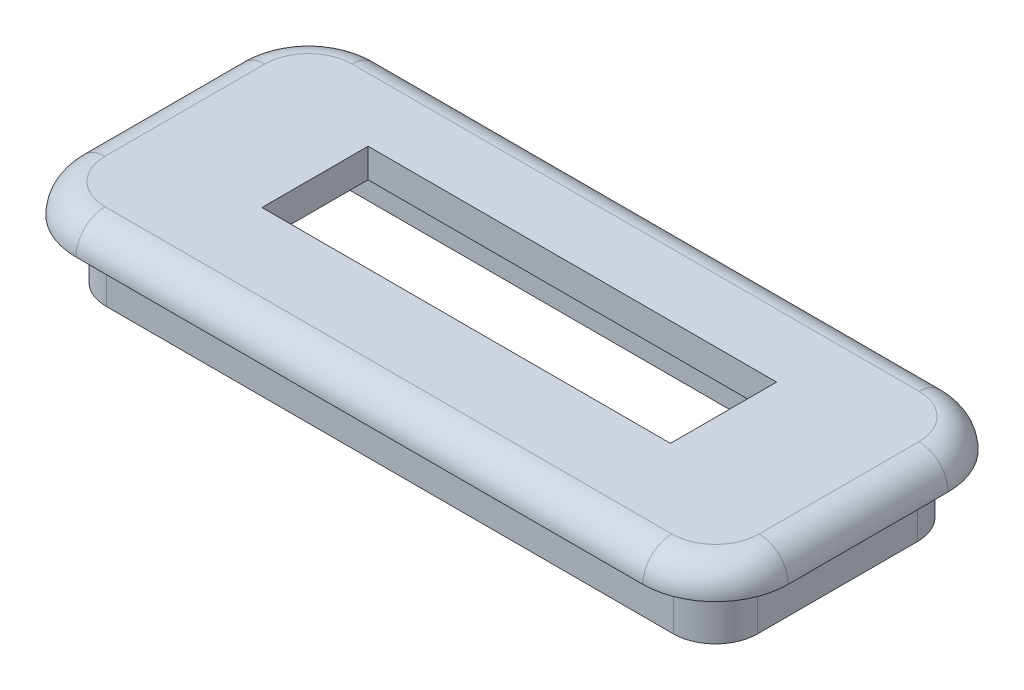
ISO-10303-21;
HEADER;
FILE_DESCRIPTION(('STEP AP214'),'2;1');
FILE_NAME('part.step','',(''),(''),'','','');
FILE_SCHEMA(('AUTOMOTIVE_DESIGN { 1 0 10303 214 1 1 1 1 }'));
ENDSEC;
DATA;
#1=APPLICATION_CONTEXT('core data for automotive mechanical design processes');
#2=APPLICATION_PROTOCOL_DEFINITION('international standard','automotive_design',2000,#1);
#3=PRODUCT_CONTEXT('',#1,'mechanical');
#4=PRODUCT('Part','Part','',(#3));
#5=PRODUCT_RELATED_PRODUCT_CATEGORY('part','',(#4));
#6=PRODUCT_DEFINITION_FORMATION('','',#4);
#7=PRODUCT_DEFINITION_CONTEXT('part definition',#1,'design');
#8=PRODUCT_DEFINITION('design','',#6,#7);
#9=PRODUCT_DEFINITION_SHAPE('','',#8);
#10=(LENGTH_UNIT() NAMED_UNIT(*) SI_UNIT(.MILLI.,.METRE.));
#11=(NAMED_UNIT(*) PLANE_ANGLE_UNIT() SI_UNIT($,.RADIAN.));
#12=(NAMED_UNIT(*) SI_UNIT($,.STERADIAN.) SOLID_ANGLE_UNIT());
#13=UNCERTAINTY_MEASURE_WITH_UNIT(LENGTH_MEASURE(1.E-05),#10,'distance_accuracy_value','');
#14=(GEOMETRIC_REPRESENTATION_CONTEXT(3) GLOBAL_UNCERTAINTY_ASSIGNED_CONTEXT((#13)) GLOBAL_UNIT_ASSIGNED_CONTEXT((#10,
#11,#12)) REPRESENTATION_CONTEXT('',''));
#15=CARTESIAN_POINT('',(0.,0.,0.));
#16=DIRECTION('',(0.,0.,1.));
#17=DIRECTION('',(1.,0.,0.));
#18=AXIS2_PLACEMENT_3D('',#15,#16,#17);
#19=CARTESIAN_POINT('',(-19.5,0.,5.5));
#20=DIRECTION('',(0.,1.,0.));
#21=DIRECTION('',(0.,0.,1.));
#22=AXIS2_PLACEMENT_3D('',#19,#20,#21);
#23=PLANE('',#22);
#24=CARTESIAN_POINT('',(-19.5,0.,5.5));
#25=DIRECTION('',(0.,1.,0.));
#26=DIRECTION('',(0.,0.,1.));
#27=AXIS2_PLACEMENT_3D('',#24,#25,#26);
#28=CIRCLE('',#27,5.);
#29=CARTESIAN_POINT('',(-24.5,0.,5.49999999999996));
#30=VERTEX_POINT('',#29);
#31=CARTESIAN_POINT('',(-19.5,0.,10.5));
#32=VERTEX_POINT('',#31);
#33=EDGE_CURVE('E381',#30,#32,#28,.T.);
#34=ORIENTED_EDGE('',*,*,#33,.F.);
#35=DIRECTION('',(0.,0.,1.));
#36=VECTOR('',#35,1.);
#37=CARTESIAN_POINT('',(-24.5,0.,-5.49999999999997));
#38=LINE('',#37,#36);
#39=CARTESIAN_POINT('',(-24.5,0.,-5.49999999999997));
#40=VERTEX_POINT('',#39);
#41=EDGE_CURVE('E402',#40,#30,#38,.T.);
#42=ORIENTED_EDGE('',*,*,#41,.F.);
#43=CARTESIAN_POINT('',(-19.5,0.,-5.5));
#44=DIRECTION('',(0.,1.,0.));
#45=DIRECTION('',(0.,0.,1.));
#46=AXIS2_PLACEMENT_3D('',#43,#44,#45);
#47=CIRCLE('',#46,5.);
#48=CARTESIAN_POINT('',(-19.5,0.,-10.5));
#49=VERTEX_POINT('',#48);
#50=EDGE_CURVE('E399',#49,#40,#47,.T.);
#51=ORIENTED_EDGE('',*,*,#50,.F.);
#52=DIRECTION('',(-1.,0.,0.));
#53=VECTOR('',#52,1.);
#54=CARTESIAN_POINT('',(-19.5,0.,-10.5));
#55=LINE('',#54,#53);
#56=CARTESIAN_POINT('',(19.5,0.,-10.5));
#57=VERTEX_POINT('',#56);
#58=EDGE_CURVE('E396',#57,#49,#55,.T.);
#59=ORIENTED_EDGE('',*,*,#58,.F.);
#60=CARTESIAN_POINT('',(19.5,0.,-5.5));
#61=DIRECTION('',(0.,1.,0.));
#62=DIRECTION('',(0.,0.,-1.));
#63=AXIS2_PLACEMENT_3D('',#60,#61,#62);
#64=CIRCLE('',#63,5.);
#65=CARTESIAN_POINT('',(24.5,0.,-5.49999999999997));
#66=VERTEX_POINT('',#65);
#67=EDGE_CURVE('E393',#66,#57,#64,.T.);
#68=ORIENTED_EDGE('',*,*,#67,.F.);
#69=DIRECTION('',(0.,0.,-1.));
#70=VECTOR('',#69,1.);
#71=CARTESIAN_POINT('',(24.5,0.,-5.49999999999997));
#72=LINE('',#71,#70);
#73=CARTESIAN_POINT('',(24.5,0.,5.49999999999996));
#74=VERTEX_POINT('',#73);
#75=EDGE_CURVE('E390',#74,#66,#72,.T.);
#76=ORIENTED_EDGE('',*,*,#75,.F.);
#77=CARTESIAN_POINT('',(19.5,0.,5.5));
#78=DIRECTION('',(0.,1.,0.));
#79=DIRECTION('',(0.,0.,1.));
#80=AXIS2_PLACEMENT_3D('',#77,#78,#79);
#81=CIRCLE('',#80,5.);
#82=CARTESIAN_POINT('',(19.5,0.,10.5));
#83=VERTEX_POINT('',#82);
#84=EDGE_CURVE('E387',#83,#74,#81,.T.);
#85=ORIENTED_EDGE('',*,*,#84,.F.);
#86=DIRECTION('',(1.,0.,0.));
#87=VECTOR('',#86,1.);
#88=CARTESIAN_POINT('',(-19.5,0.,10.5));
#89=LINE('',#88,#87);
#90=EDGE_CURVE('E384',#32,#83,#89,.T.);
#91=ORIENTED_EDGE('',*,*,#90,.F.);
#92=EDGE_LOOP('',(#34,#42,#51,#59,#68,#76,#85,#91));
#93=FACE_BOUND('',#92,.T.);
#94=CARTESIAN_POINT('',(-19.5,0.,5.5));
#95=DIRECTION('',(0.,-1.,0.));
#96=DIRECTION('',(0.,0.,-1.));
#97=AXIS2_PLACEMENT_3D('',#94,#95,#96);
#98=CIRCLE('',#97,2.9);
#99=CARTESIAN_POINT('',(-19.5,0.,8.4));
#100=VERTEX_POINT('',#99);
#101=CARTESIAN_POINT('',(-22.4,0.,5.49999999999998));
#102=VERTEX_POINT('',#101);
#103=EDGE_CURVE('E316',#100,#102,#98,.T.);
#104=ORIENTED_EDGE('',*,*,#103,.F.);
#105=DIRECTION('',(-1.,0.,0.));
#106=VECTOR('',#105,1.);
#107=CARTESIAN_POINT('',(19.5,0.,8.4));
#108=LINE('',#107,#106);
#109=CARTESIAN_POINT('',(19.5,0.,8.4));
#110=VERTEX_POINT('',#109);
#111=EDGE_CURVE('E321',#110,#100,#108,.T.);
#112=ORIENTED_EDGE('',*,*,#111,.F.);
#113=CARTESIAN_POINT('',(19.5,0.,5.5));
#114=DIRECTION('',(0.,-1.,0.));
#115=DIRECTION('',(0.,0.,-1.));
#116=AXIS2_PLACEMENT_3D('',#113,#114,#115);
#117=CIRCLE('',#116,2.9);
#118=CARTESIAN_POINT('',(22.4,0.,5.49999999999996));
#119=VERTEX_POINT('',#118);
#120=EDGE_CURVE('E353',#119,#110,#117,.T.);
#121=ORIENTED_EDGE('',*,*,#120,.F.);
#122=DIRECTION('',(0.,0.,1.));
#123=VECTOR('',#122,1.);
#124=CARTESIAN_POINT('',(22.4,0.,-5.5));
#125=LINE('',#124,#123);
#126=CARTESIAN_POINT('',(22.4,0.,-5.5));
#127=VERTEX_POINT('',#126);
#128=EDGE_CURVE('E350',#127,#119,#125,.T.);
#129=ORIENTED_EDGE('',*,*,#128,.F.);
#130=CARTESIAN_POINT('',(19.5,0.,-5.5));
#131=DIRECTION('',(0.,-1.,0.));
#132=DIRECTION('',(0.,0.,-1.));
#133=AXIS2_PLACEMENT_3D('',#130,#131,#132);
#134=CIRCLE('',#133,2.9);
#135=CARTESIAN_POINT('',(19.5,0.,-8.4));
#136=VERTEX_POINT('',#135);
#137=EDGE_CURVE('E347',#136,#127,#134,.T.);
#138=ORIENTED_EDGE('',*,*,#137,.F.);
#139=DIRECTION('',(1.,0.,0.));
#140=VECTOR('',#139,1.);
#141=CARTESIAN_POINT('',(-19.5,0.,-8.4));
#142=LINE('',#141,#140);
#143=CARTESIAN_POINT('',(-19.5,0.,-8.4));
#144=VERTEX_POINT('',#143);
#145=EDGE_CURVE('E344',#144,#136,#142,.T.);
#146=ORIENTED_EDGE('',*,*,#145,.F.);
#147=CARTESIAN_POINT('',(-19.5,0.,-5.5));
#148=DIRECTION('',(0.,-1.,0.));
#149=DIRECTION('',(0.,0.,-1.));
#150=AXIS2_PLACEMENT_3D('',#147,#148,#149);
#151=CIRCLE('',#150,2.9);
#152=CARTESIAN_POINT('',(-22.4,0.,-5.49999999999997));
#153=VERTEX_POINT('',#152);
#154=EDGE_CURVE('E341',#153,#144,#151,.T.);
#155=ORIENTED_EDGE('',*,*,#154,.F.);
#156=DIRECTION('',(0.,0.,-1.));
#157=VECTOR('',#156,1.);
#158=CARTESIAN_POINT('',(-22.4,0.,5.49999999999998));
#159=LINE('',#158,#157);
#160=EDGE_CURVE('E338',#102,#153,#159,.T.);
#161=ORIENTED_EDGE('',*,*,#160,.F.);
#162=EDGE_LOOP('',(#104,#112,#121,#129,#138,#146,#155,#161));
#163=FACE_BOUND('',#162,.T.);
#164=ADVANCED_FACE('F39',(#93,#163),#23,.F.);
#165=CARTESIAN_POINT('',(-19.5,2.,5.5));
#166=DIRECTION('',(0.,1.,0.));
#167=DIRECTION('',(0.,0.,1.));
#168=AXIS2_PLACEMENT_3D('',#165,#166,#167);
#169=PLANE('',#168);
#170=DIRECTION('',(-1.,0.,0.));
#171=VECTOR('',#170,1.);
#172=CARTESIAN_POINT('',(-19.5,2.,-8.5));
#173=LINE('',#172,#171);
#174=CARTESIAN_POINT('',(19.5,2.,-8.5));
#175=VERTEX_POINT('',#174);
#176=CARTESIAN_POINT('',(-19.5,2.,-8.5));
#177=VERTEX_POINT('',#176);
#178=EDGE_CURVE('E48',#175,#177,#173,.T.);
#179=ORIENTED_EDGE('',*,*,#178,.T.);
#180=CARTESIAN_POINT('',(-19.5,2.,-5.5));
#181=DIRECTION('',(0.,1.,0.));
#182=DIRECTION('',(0.,0.,1.));
#183=AXIS2_PLACEMENT_3D('',#180,#181,#182);
#184=CIRCLE('',#183,3.);
#185=CARTESIAN_POINT('',(-22.5,2.,-5.49999999999998));
#186=VERTEX_POINT('',#185);
#187=EDGE_CURVE('E11',#177,#186,#184,.T.);
#188=ORIENTED_EDGE('',*,*,#187,.T.);
#189=DIRECTION('',(0.,0.,1.));
#190=VECTOR('',#189,1.);
#191=CARTESIAN_POINT('',(-22.5,2.,5.49999999999996));
#192=LINE('',#191,#190);
#193=CARTESIAN_POINT('',(-22.5,2.,5.49999999999998));
#194=VERTEX_POINT('',#193);
#195=EDGE_CURVE('E414',#186,#194,#192,.T.);
#196=ORIENTED_EDGE('',*,*,#195,.T.);
#197=CARTESIAN_POINT('',(-19.5,2.,5.5));
#198=DIRECTION('',(0.,1.,0.));
#199=DIRECTION('',(0.,0.,1.));
#200=AXIS2_PLACEMENT_3D('',#197,#198,#199);
#201=CIRCLE('',#200,3.);
#202=CARTESIAN_POINT('',(-19.5,2.,8.5));
#203=VERTEX_POINT('',#202);
#204=EDGE_CURVE('E416',#194,#203,#201,.T.);
#205=ORIENTED_EDGE('',*,*,#204,.T.);
#206=DIRECTION('',(1.,0.,0.));
#207=VECTOR('',#206,1.);
#208=CARTESIAN_POINT('',(19.5,2.,8.5));
#209=LINE('',#208,#207);
#210=CARTESIAN_POINT('',(19.5,2.,8.5));
#211=VERTEX_POINT('',#210);
#212=EDGE_CURVE('E418',#203,#211,#209,.T.);
#213=ORIENTED_EDGE('',*,*,#212,.T.);
#214=CARTESIAN_POINT('',(19.5,2.,5.5));
#215=DIRECTION('',(0.,1.,0.));
#216=DIRECTION('',(0.,0.,1.));
#217=AXIS2_PLACEMENT_3D('',#214,#215,#216);
#218=CIRCLE('',#217,3.);
#219=CARTESIAN_POINT('',(22.5,2.,5.49999999999997));
#220=VERTEX_POINT('',#219);
#221=EDGE_CURVE('E420',#211,#220,#218,.T.);
#222=ORIENTED_EDGE('',*,*,#221,.T.);
#223=DIRECTION('',(0.,0.,-1.));
#224=VECTOR('',#223,1.);
#225=CARTESIAN_POINT('',(22.5,2.,-5.49999999999997));
#226=LINE('',#225,#224);
#227=CARTESIAN_POINT('',(22.5,2.,-5.49999999999998));
#228=VERTEX_POINT('',#227);
#229=EDGE_CURVE('E422',#220,#228,#226,.T.);
#230=ORIENTED_EDGE('',*,*,#229,.T.);
#231=CARTESIAN_POINT('',(19.5,2.,-5.5));
#232=DIRECTION('',(0.,1.,0.));
#233=DIRECTION('',(0.,0.,1.));
#234=AXIS2_PLACEMENT_3D('',#231,#232,#233);
#235=CIRCLE('',#234,3.);
#236=EDGE_CURVE('E59',#228,#175,#235,.T.);
#237=ORIENTED_EDGE('',*,*,#236,.T.);
#238=EDGE_LOOP('',(#179,#188,#196,#205,#213,#222,#230,#237));
#239=FACE_BOUND('',#238,.T.);
#240=DIRECTION('',(0.,0.,-1.));
#241=VECTOR('',#240,1.);
#242=CARTESIAN_POINT('',(14.05,2.,-4.15));
#243=LINE('',#242,#241);
#244=CARTESIAN_POINT('',(14.05,2.,3.15));
#245=VERTEX_POINT('',#244);
#246=CARTESIAN_POINT('',(14.05,2.,-4.15));
#247=VERTEX_POINT('',#246);
#248=EDGE_CURVE('E245',#245,#247,#243,.T.);
#249=ORIENTED_EDGE('',*,*,#248,.F.);
#250=DIRECTION('',(1.,0.,0.));
#251=VECTOR('',#250,1.);
#252=CARTESIAN_POINT('',(-14.05,2.,3.15));
#253=LINE('',#252,#251);
#254=CARTESIAN_POINT('',(-14.05,2.,3.15));
#255=VERTEX_POINT('',#254);
#256=EDGE_CURVE('E249',#255,#245,#253,.T.);
#257=ORIENTED_EDGE('',*,*,#256,.F.);
#258=DIRECTION('',(0.,0.,1.));
#259=VECTOR('',#258,1.);
#260=CARTESIAN_POINT('',(-14.05,2.,-4.15));
#261=LINE('',#260,#259);
#262=CARTESIAN_POINT('',(-14.05,2.,-4.15));
#263=VERTEX_POINT('',#262);
#264=EDGE_CURVE('E229',#263,#255,#261,.T.);
#265=ORIENTED_EDGE('',*,*,#264,.F.);
#266=DIRECTION('',(-1.,0.,0.));
#267=VECTOR('',#266,1.);
#268=CARTESIAN_POINT('',(-14.05,2.,-4.15));
#269=LINE('',#268,#267);
#270=EDGE_CURVE('E240',#247,#263,#269,.T.);
#271=ORIENTED_EDGE('',*,*,#270,.F.);
#272=EDGE_LOOP('',(#249,#257,#265,#271));
#273=FACE_BOUND('',#272,.T.);
#274=ADVANCED_FACE('F247',(#239,#273),#169,.T.);
#275=CARTESIAN_POINT('',(-19.5,-4.,5.5));
#276=DIRECTION('',(0.,-1.,0.));
#277=DIRECTION('',(0.,0.,-1.));
#278=AXIS2_PLACEMENT_3D('',#275,#276,#277);
#279=PLANE('',#278);
#280=CARTESIAN_POINT('',(-19.5,-4.,5.5));
#281=DIRECTION('',(0.,-1.,0.));
#282=DIRECTION('',(0.,0.,-1.));
#283=AXIS2_PLACEMENT_3D('',#280,#281,#282);
#284=CIRCLE('',#283,2.9);
#285=CARTESIAN_POINT('',(-19.5,-4.,8.4));
#286=VERTEX_POINT('',#285);
#287=CARTESIAN_POINT('',(-22.4,-4.,5.49999999999998));
#288=VERTEX_POINT('',#287);
#289=EDGE_CURVE('E317',#286,#288,#284,.T.);
#290=ORIENTED_EDGE('',*,*,#289,.T.);
#291=DIRECTION('',(0.,0.,-1.));
#292=VECTOR('',#291,1.);
#293=CARTESIAN_POINT('',(-22.4,-4.,5.49999999999998));
#294=LINE('',#293,#292);
#295=CARTESIAN_POINT('',(-22.4,-4.,-5.49999999999997));
#296=VERTEX_POINT('',#295);
#297=EDGE_CURVE('E320',#288,#296,#294,.T.);
#298=ORIENTED_EDGE('',*,*,#297,.T.);
#299=CARTESIAN_POINT('',(-19.5,-4.,-5.5));
#300=DIRECTION('',(0.,-1.,0.));
#301=DIRECTION('',(0.,0.,-1.));
#302=AXIS2_PLACEMENT_3D('',#299,#300,#301);
#303=CIRCLE('',#302,2.9);
#304=CARTESIAN_POINT('',(-19.5,-4.,-8.4));
#305=VERTEX_POINT('',#304);
#306=EDGE_CURVE('E323',#296,#305,#303,.T.);
#307=ORIENTED_EDGE('',*,*,#306,.T.);
#308=DIRECTION('',(1.,0.,0.));
#309=VECTOR('',#308,1.);
#310=CARTESIAN_POINT('',(-19.5,-4.,-8.4));
#311=LINE('',#310,#309);
#312=CARTESIAN_POINT('',(19.5,-4.,-8.4));
#313=VERTEX_POINT('',#312);
#314=EDGE_CURVE('E325',#305,#313,#311,.T.);
#315=ORIENTED_EDGE('',*,*,#314,.T.);
#316=CARTESIAN_POINT('',(19.5,-4.,-5.5));
#317=DIRECTION('',(0.,-1.,0.));
#318=DIRECTION('',(0.,0.,-1.));
#319=AXIS2_PLACEMENT_3D('',#316,#317,#318);
#320=CIRCLE('',#319,2.9);
#321=CARTESIAN_POINT('',(22.4,-4.,-5.5));
#322=VERTEX_POINT('',#321);
#323=EDGE_CURVE('E327',#313,#322,#320,.T.);
#324=ORIENTED_EDGE('',*,*,#323,.T.);
#325=DIRECTION('',(0.,0.,1.));
#326=VECTOR('',#325,1.);
#327=CARTESIAN_POINT('',(22.4,-4.,-5.5));
#328=LINE('',#327,#326);
#329=CARTESIAN_POINT('',(22.4,-4.,5.49999999999996));
#330=VERTEX_POINT('',#329);
#331=EDGE_CURVE('E329',#322,#330,#328,.T.);
#332=ORIENTED_EDGE('',*,*,#331,.T.);
#333=CARTESIAN_POINT('',(19.5,-4.,5.5));
#334=DIRECTION('',(0.,-1.,0.));
#335=DIRECTION('',(0.,0.,-1.));
#336=AXIS2_PLACEMENT_3D('',#333,#334,#335);
#337=CIRCLE('',#336,2.9);
#338=CARTESIAN_POINT('',(19.5,-4.,8.4));
#339=VERTEX_POINT('',#338);
#340=EDGE_CURVE('E331',#330,#339,#337,.T.);
#341=ORIENTED_EDGE('',*,*,#340,.T.);
#342=DIRECTION('',(-1.,0.,0.));
#343=VECTOR('',#342,1.);
#344=CARTESIAN_POINT('',(19.5,-4.,8.4));
#345=LINE('',#344,#343);
#346=EDGE_CURVE('E333',#339,#286,#345,.T.);
#347=ORIENTED_EDGE('',*,*,#346,.T.);
#348=EDGE_LOOP('',(#290,#298,#307,#315,#324,#332,#341,#347));
#349=FACE_BOUND('',#348,.T.);
#350=DIRECTION('',(0.,0.,-1.));
#351=VECTOR('',#350,1.);
#352=CARTESIAN_POINT('',(-20.9,-4.,5.49999999999999));
#353=LINE('',#352,#351);
#354=CARTESIAN_POINT('',(-20.9,-4.,5.49999999999999));
#355=VERTEX_POINT('',#354);
#356=CARTESIAN_POINT('',(-20.9,-4.,-5.49999999999997));
#357=VERTEX_POINT('',#356);
#358=EDGE_CURVE('E261',#355,#357,#353,.T.);
#359=ORIENTED_EDGE('',*,*,#358,.F.);
#360=CARTESIAN_POINT('',(-19.5,-4.,5.5));
#361=DIRECTION('',(0.,-1.,0.));
#362=DIRECTION('',(0.,0.,-1.));
#363=AXIS2_PLACEMENT_3D('',#360,#361,#362);
#364=CIRCLE('',#363,1.4);
#365=CARTESIAN_POINT('',(-19.5,-4.,6.9));
#366=VERTEX_POINT('',#365);
#367=EDGE_CURVE('E259',#366,#355,#364,.T.);
#368=ORIENTED_EDGE('',*,*,#367,.F.);
#369=DIRECTION('',(-1.,0.,0.));
#370=VECTOR('',#369,1.);
#371=CARTESIAN_POINT('',(19.5,-4.,6.9));
#372=LINE('',#371,#370);
#373=CARTESIAN_POINT('',(19.5,-4.,6.9));
#374=VERTEX_POINT('',#373);
#375=EDGE_CURVE('E275',#374,#366,#372,.T.);
#376=ORIENTED_EDGE('',*,*,#375,.F.);
#377=CARTESIAN_POINT('',(19.5,-4.,5.5));
#378=DIRECTION('',(0.,-1.,0.));
#379=DIRECTION('',(0.,0.,-1.));
#380=AXIS2_PLACEMENT_3D('',#377,#378,#379);
#381=CIRCLE('',#380,1.4);
#382=CARTESIAN_POINT('',(20.9,-4.,5.49999999999996));
#383=VERTEX_POINT('',#382);
#384=EDGE_CURVE('E272',#383,#374,#381,.T.);
#385=ORIENTED_EDGE('',*,*,#384,.F.);
#386=DIRECTION('',(0.,0.,1.));
#387=VECTOR('',#386,1.);
#388=CARTESIAN_POINT('',(20.9,-4.,-5.5));
#389=LINE('',#388,#387);
#390=CARTESIAN_POINT('',(20.9,-4.,-5.5));
#391=VERTEX_POINT('',#390);
#392=EDGE_CURVE('E270',#391,#383,#389,.T.);
#393=ORIENTED_EDGE('',*,*,#392,.F.);
#394=CARTESIAN_POINT('',(19.5,-4.,-5.5));
#395=DIRECTION('',(0.,-1.,0.));
#396=DIRECTION('',(0.,0.,-1.));
#397=AXIS2_PLACEMENT_3D('',#394,#395,#396);
#398=CIRCLE('',#397,1.4);
#399=CARTESIAN_POINT('',(19.5,-4.,-6.9));
#400=VERTEX_POINT('',#399);
#401=EDGE_CURVE('E268',#400,#391,#398,.T.);
#402=ORIENTED_EDGE('',*,*,#401,.F.);
#403=DIRECTION('',(1.,0.,0.));
#404=VECTOR('',#403,1.);
#405=CARTESIAN_POINT('',(-19.5,-4.,-6.9));
#406=LINE('',#405,#404);
#407=CARTESIAN_POINT('',(-19.5,-4.,-6.9));
#408=VERTEX_POINT('',#407);
#409=EDGE_CURVE('E266',#408,#400,#406,.T.);
#410=ORIENTED_EDGE('',*,*,#409,.F.);
#411=CARTESIAN_POINT('',(-19.5,-4.,-5.5));
#412=DIRECTION('',(0.,-1.,0.));
#413=DIRECTION('',(0.,0.,-1.));
#414=AXIS2_PLACEMENT_3D('',#411,#412,#413);
#415=CIRCLE('',#414,1.39999999999999);
#416=EDGE_CURVE('E264',#357,#408,#415,.T.);
#417=ORIENTED_EDGE('',*,*,#416,.F.);
#418=EDGE_LOOP('',(#359,#368,#376,#385,#393,#402,#410,#417));
#419=FACE_BOUND('',#418,.T.);
#420=ADVANCED_FACE('F477',(#349,#419),#279,.T.);
#421=CARTESIAN_POINT('',(-19.5,-4.,5.5));
#422=DIRECTION('',(0.,1.,0.));
#423=DIRECTION('',(0.,0.,1.));
#424=AXIS2_PLACEMENT_3D('',#421,#422,#423);
#425=CYLINDRICAL_SURFACE('',#424,2.9);
#426=ORIENTED_EDGE('',*,*,#103,.T.);
#427=DIRECTION('',(0.,1.,0.));
#428=VECTOR('',#427,1.);
#429=CARTESIAN_POINT('',(-22.4,-4.,5.49999999999998));
#430=LINE('',#429,#428);
#431=EDGE_CURVE('E378',#288,#102,#430,.T.);
#432=ORIENTED_EDGE('',*,*,#431,.F.);
#433=ORIENTED_EDGE('',*,*,#289,.F.);
#434=DIRECTION('',(0.,1.,0.));
#435=VECTOR('',#434,1.);
#436=CARTESIAN_POINT('',(-19.5,-4.,8.4));
#437=LINE('',#436,#435);
#438=EDGE_CURVE('E335',#286,#100,#437,.T.);
#439=ORIENTED_EDGE('',*,*,#438,.T.);
#440=EDGE_LOOP('',(#426,#432,#433,#439));
#441=FACE_BOUND('',#440,.T.);
#442=ADVANCED_FACE('F741',(#441),#425,.T.);
#443=CARTESIAN_POINT('',(-22.4,-4.,5.49999999999998));
#444=DIRECTION('',(1.,0.,0.));
#445=DIRECTION('',(0.,0.,-1.));
#446=AXIS2_PLACEMENT_3D('',#443,#444,#445);
#447=PLANE('',#446);
#448=ORIENTED_EDGE('',*,*,#160,.T.);
#449=DIRECTION('',(0.,1.,0.));
#450=VECTOR('',#449,1.);
#451=CARTESIAN_POINT('',(-22.4,-4.,-5.49999999999997));
#452=LINE('',#451,#450);
#453=EDGE_CURVE('E375',#296,#153,#452,.T.);
#454=ORIENTED_EDGE('',*,*,#453,.F.);
#455=ORIENTED_EDGE('',*,*,#297,.F.);
#456=ORIENTED_EDGE('',*,*,#431,.T.);
#457=EDGE_LOOP('',(#448,#454,#455,#456));
#458=FACE_BOUND('',#457,.T.);
#459=ADVANCED_FACE('F732',(#458),#447,.F.);
#460=CARTESIAN_POINT('',(-19.5,-4.,-5.5));
#461=DIRECTION('',(0.,1.,0.));
#462=DIRECTION('',(0.,0.,1.));
#463=AXIS2_PLACEMENT_3D('',#460,#461,#462);
#464=CYLINDRICAL_SURFACE('',#463,2.9);
#465=ORIENTED_EDGE('',*,*,#154,.T.);
#466=DIRECTION('',(0.,1.,0.));
#467=VECTOR('',#466,1.);
#468=CARTESIAN_POINT('',(-19.5,-4.,-8.4));
#469=LINE('',#468,#467);
#470=EDGE_CURVE('E372',#305,#144,#469,.T.);
#471=ORIENTED_EDGE('',*,*,#470,.F.);
#472=ORIENTED_EDGE('',*,*,#306,.F.);
#473=ORIENTED_EDGE('',*,*,#453,.T.);
#474=EDGE_LOOP('',(#465,#471,#472,#473));
#475=FACE_BOUND('',#474,.T.);
#476=ADVANCED_FACE('F723',(#475),#464,.T.);
#477=CARTESIAN_POINT('',(-19.5,-4.,-8.4));
#478=DIRECTION('',(0.,0.,1.));
#479=DIRECTION('',(1.,0.,0.));
#480=AXIS2_PLACEMENT_3D('',#477,#478,#479);
#481=PLANE('',#480);
#482=ORIENTED_EDGE('',*,*,#145,.T.);
#483=DIRECTION('',(0.,1.,0.));
#484=VECTOR('',#483,1.);
#485=CARTESIAN_POINT('',(19.5,-4.,-8.4));
#486=LINE('',#485,#484);
#487=EDGE_CURVE('E369',#313,#136,#486,.T.);
#488=ORIENTED_EDGE('',*,*,#487,.F.);
#489=ORIENTED_EDGE('',*,*,#314,.F.);
#490=ORIENTED_EDGE('',*,*,#470,.T.);
#491=EDGE_LOOP('',(#482,#488,#489,#490));
#492=FACE_BOUND('',#491,.T.);
#493=ADVANCED_FACE('F714',(#492),#481,.F.);
#494=CARTESIAN_POINT('',(19.5,-4.,-5.5));
#495=DIRECTION('',(0.,1.,0.));
#496=DIRECTION('',(0.,0.,1.));
#497=AXIS2_PLACEMENT_3D('',#494,#495,#496);
#498=CYLINDRICAL_SURFACE('',#497,2.9);
#499=ORIENTED_EDGE('',*,*,#137,.T.);
#500=DIRECTION('',(0.,1.,0.));
#501=VECTOR('',#500,1.);
#502=CARTESIAN_POINT('',(22.4,-4.,-5.5));
#503=LINE('',#502,#501);
#504=EDGE_CURVE('E366',#322,#127,#503,.T.);
#505=ORIENTED_EDGE('',*,*,#504,.F.);
#506=ORIENTED_EDGE('',*,*,#323,.F.);
#507=ORIENTED_EDGE('',*,*,#487,.T.);
#508=EDGE_LOOP('',(#499,#505,#506,#507));
#509=FACE_BOUND('',#508,.T.);
#510=ADVANCED_FACE('F705',(#509),#498,.T.);
#511=CARTESIAN_POINT('',(22.4,-4.,-5.5));
#512=DIRECTION('',(-1.,0.,0.));
#513=DIRECTION('',(0.,0.,1.));
#514=AXIS2_PLACEMENT_3D('',#511,#512,#513);
#515=PLANE('',#514);
#516=ORIENTED_EDGE('',*,*,#128,.T.);
#517=DIRECTION('',(0.,1.,0.));
#518=VECTOR('',#517,1.);
#519=CARTESIAN_POINT('',(22.4,-4.,5.49999999999996));
#520=LINE('',#519,#518);
#521=EDGE_CURVE('E363',#330,#119,#520,.T.);
#522=ORIENTED_EDGE('',*,*,#521,.F.);
#523=ORIENTED_EDGE('',*,*,#331,.F.);
#524=ORIENTED_EDGE('',*,*,#504,.T.);
#525=EDGE_LOOP('',(#516,#522,#523,#524));
#526=FACE_BOUND('',#525,.T.);
#527=ADVANCED_FACE('F696',(#526),#515,.F.);
#528=CARTESIAN_POINT('',(19.5,-4.,5.5));
#529=DIRECTION('',(0.,1.,0.));
#530=DIRECTION('',(0.,0.,1.));
#531=AXIS2_PLACEMENT_3D('',#528,#529,#530);
#532=CYLINDRICAL_SURFACE('',#531,2.9);
#533=ORIENTED_EDGE('',*,*,#120,.T.);
#534=DIRECTION('',(0.,1.,0.));
#535=VECTOR('',#534,1.);
#536=CARTESIAN_POINT('',(19.5,-4.,8.4));
#537=LINE('',#536,#535);
#538=EDGE_CURVE('E360',#339,#110,#537,.T.);
#539=ORIENTED_EDGE('',*,*,#538,.F.);
#540=ORIENTED_EDGE('',*,*,#340,.F.);
#541=ORIENTED_EDGE('',*,*,#521,.T.);
#542=EDGE_LOOP('',(#533,#539,#540,#541));
#543=FACE_BOUND('',#542,.T.);
#544=ADVANCED_FACE('F687',(#543),#532,.T.);
#545=CARTESIAN_POINT('',(19.5,-4.,8.4));
#546=DIRECTION('',(0.,0.,-1.));
#547=DIRECTION('',(-1.,0.,0.));
#548=AXIS2_PLACEMENT_3D('',#545,#546,#547);
#549=PLANE('',#548);
#550=ORIENTED_EDGE('',*,*,#111,.T.);
#551=ORIENTED_EDGE('',*,*,#438,.F.);
#552=ORIENTED_EDGE('',*,*,#346,.F.);
#553=ORIENTED_EDGE('',*,*,#538,.T.);
#554=EDGE_LOOP('',(#550,#551,#552,#553));
#555=FACE_BOUND('',#554,.T.);
#556=ADVANCED_FACE('F679',(#555),#549,.F.);
#557=CARTESIAN_POINT('',(-19.5,-4.,5.5));
#558=DIRECTION('',(0.,1.,0.));
#559=DIRECTION('',(0.,0.,1.));
#560=AXIS2_PLACEMENT_3D('',#557,#558,#559);
#561=CYLINDRICAL_SURFACE('',#560,1.4);
#562=CARTESIAN_POINT('',(-19.5,0.,5.5));
#563=DIRECTION('',(0.,-1.,0.));
#564=DIRECTION('',(0.,0.,-1.));
#565=AXIS2_PLACEMENT_3D('',#562,#563,#564);
#566=CIRCLE('',#565,1.4);
#567=CARTESIAN_POINT('',(-19.5,0.,6.9));
#568=VERTEX_POINT('',#567);
#569=CARTESIAN_POINT('',(-20.9,0.,5.49999999999999));
#570=VERTEX_POINT('',#569);
#571=EDGE_CURVE('E256',#568,#570,#566,.T.);
#572=ORIENTED_EDGE('',*,*,#571,.F.);
#573=DIRECTION('',(0.,1.,0.));
#574=VECTOR('',#573,1.);
#575=CARTESIAN_POINT('',(-19.5,-4.,6.9));
#576=LINE('',#575,#574);
#577=EDGE_CURVE('E277',#366,#568,#576,.T.);
#578=ORIENTED_EDGE('',*,*,#577,.F.);
#579=ORIENTED_EDGE('',*,*,#367,.T.);
#580=DIRECTION('',(0.,1.,0.));
#581=VECTOR('',#580,1.);
#582=CARTESIAN_POINT('',(-20.9,-4.,5.49999999999999));
#583=LINE('',#582,#581);
#584=EDGE_CURVE('E313',#355,#570,#583,.T.);
#585=ORIENTED_EDGE('',*,*,#584,.T.);
#586=EDGE_LOOP('',(#572,#578,#579,#585));
#587=FACE_BOUND('',#586,.T.);
#588=ADVANCED_FACE('F469',(#587),#561,.F.);
#589=CARTESIAN_POINT('',(-20.9,-4.,5.49999999999999));
#590=DIRECTION('',(1.,0.,0.));
#591=DIRECTION('',(0.,0.,-1.));
#592=AXIS2_PLACEMENT_3D('',#589,#590,#591);
#593=PLANE('',#592);
#594=DIRECTION('',(0.,0.,-1.));
#595=VECTOR('',#594,1.);
#596=CARTESIAN_POINT('',(-20.9,0.,5.49999999999999));
#597=LINE('',#596,#595);
#598=CARTESIAN_POINT('',(-20.9,0.,-5.49999999999997));
#599=VERTEX_POINT('',#598);
#600=EDGE_CURVE('E280',#570,#599,#597,.T.);
#601=ORIENTED_EDGE('',*,*,#600,.F.);
#602=ORIENTED_EDGE('',*,*,#584,.F.);
#603=ORIENTED_EDGE('',*,*,#358,.T.);
#604=DIRECTION('',(0.,1.,0.));
#605=VECTOR('',#604,1.);
#606=CARTESIAN_POINT('',(-20.9,-4.,-5.49999999999997));
#607=LINE('',#606,#605);
#608=EDGE_CURVE('E311',#357,#599,#607,.T.);
#609=ORIENTED_EDGE('',*,*,#608,.T.);
#610=EDGE_LOOP('',(#601,#602,#603,#609));
#611=FACE_BOUND('',#610,.T.);
#612=ADVANCED_FACE('F473',(#611),#593,.T.);
#613=CARTESIAN_POINT('',(-19.5,-4.,-5.5));
#614=DIRECTION('',(0.,1.,0.));
#615=DIRECTION('',(0.,0.,1.));
#616=AXIS2_PLACEMENT_3D('',#613,#614,#615);
#617=CYLINDRICAL_SURFACE('',#616,1.39999999999999);
#618=CARTESIAN_POINT('',(-19.5,0.,-5.5));
#619=DIRECTION('',(0.,-1.,0.));
#620=DIRECTION('',(0.,0.,-1.));
#621=AXIS2_PLACEMENT_3D('',#618,#619,#620);
#622=CIRCLE('',#621,1.39999999999999);
#623=CARTESIAN_POINT('',(-19.5,0.,-6.9));
#624=VERTEX_POINT('',#623);
#625=EDGE_CURVE('E283',#599,#624,#622,.T.);
#626=ORIENTED_EDGE('',*,*,#625,.F.);
#627=ORIENTED_EDGE('',*,*,#608,.F.);
#628=ORIENTED_EDGE('',*,*,#416,.T.);
#629=DIRECTION('',(0.,1.,0.));
#630=VECTOR('',#629,1.);
#631=CARTESIAN_POINT('',(-19.5,-4.,-6.9));
#632=LINE('',#631,#630);
#633=EDGE_CURVE('E309',#408,#624,#632,.T.);
#634=ORIENTED_EDGE('',*,*,#633,.T.);
#635=EDGE_LOOP('',(#626,#627,#628,#634));
#636=FACE_BOUND('',#635,.T.);
#637=ADVANCED_FACE('F483',(#636),#617,.F.);
#638=CARTESIAN_POINT('',(-19.5,-4.,-6.9));
#639=DIRECTION('',(0.,0.,1.));
#640=DIRECTION('',(1.,0.,0.));
#641=AXIS2_PLACEMENT_3D('',#638,#639,#640);
#642=PLANE('',#641);
#643=DIRECTION('',(1.,0.,0.));
#644=VECTOR('',#643,1.);
#645=CARTESIAN_POINT('',(-19.5,0.,-6.9));
#646=LINE('',#645,#644);
#647=CARTESIAN_POINT('',(19.5,0.,-6.9));
#648=VERTEX_POINT('',#647);
#649=EDGE_CURVE('E286',#624,#648,#646,.T.);
#650=ORIENTED_EDGE('',*,*,#649,.F.);
#651=ORIENTED_EDGE('',*,*,#633,.F.);
#652=ORIENTED_EDGE('',*,*,#409,.T.);
#653=DIRECTION('',(0.,1.,0.));
#654=VECTOR('',#653,1.);
#655=CARTESIAN_POINT('',(19.5,-4.,-6.9));
#656=LINE('',#655,#654);
#657=EDGE_CURVE('E307',#400,#648,#656,.T.);
#658=ORIENTED_EDGE('',*,*,#657,.T.);
#659=EDGE_LOOP('',(#650,#651,#652,#658));
#660=FACE_BOUND('',#659,.T.);
#661=ADVANCED_FACE('F486',(#660),#642,.T.);
#662=CARTESIAN_POINT('',(19.5,-4.,-5.5));
#663=DIRECTION('',(0.,1.,0.));
#664=DIRECTION('',(0.,0.,1.));
#665=AXIS2_PLACEMENT_3D('',#662,#663,#664);
#666=CYLINDRICAL_SURFACE('',#665,1.4);
#667=CARTESIAN_POINT('',(19.5,0.,-5.5));
#668=DIRECTION('',(0.,-1.,0.));
#669=DIRECTION('',(0.,0.,-1.));
#670=AXIS2_PLACEMENT_3D('',#667,#668,#669);
#671=CIRCLE('',#670,1.4);
#672=CARTESIAN_POINT('',(20.9,0.,-5.5));
#673=VERTEX_POINT('',#672);
#674=EDGE_CURVE('E289',#648,#673,#671,.T.);
#675=ORIENTED_EDGE('',*,*,#674,.F.);
#676=ORIENTED_EDGE('',*,*,#657,.F.);
#677=ORIENTED_EDGE('',*,*,#401,.T.);
#678=DIRECTION('',(0.,1.,0.));
#679=VECTOR('',#678,1.);
#680=CARTESIAN_POINT('',(20.9,-4.,-5.5));
#681=LINE('',#680,#679);
#682=EDGE_CURVE('E305',#391,#673,#681,.T.);
#683=ORIENTED_EDGE('',*,*,#682,.T.);
#684=EDGE_LOOP('',(#675,#676,#677,#683));
#685=FACE_BOUND('',#684,.T.);
#686=ADVANCED_FACE('F491',(#685),#666,.F.);
#687=CARTESIAN_POINT('',(20.9,-4.,-5.5));
#688=DIRECTION('',(-1.,0.,0.));
#689=DIRECTION('',(0.,0.,1.));
#690=AXIS2_PLACEMENT_3D('',#687,#688,#689);
#691=PLANE('',#690);
#692=DIRECTION('',(0.,0.,1.));
#693=VECTOR('',#692,1.);
#694=CARTESIAN_POINT('',(20.9,0.,-5.5));
#695=LINE('',#694,#693);
#696=CARTESIAN_POINT('',(20.9,0.,5.49999999999996));
#697=VERTEX_POINT('',#696);
#698=EDGE_CURVE('E292',#673,#697,#695,.T.);
#699=ORIENTED_EDGE('',*,*,#698,.F.);
#700=ORIENTED_EDGE('',*,*,#682,.F.);
#701=ORIENTED_EDGE('',*,*,#392,.T.);
#702=DIRECTION('',(0.,1.,0.));
#703=VECTOR('',#702,1.);
#704=CARTESIAN_POINT('',(20.9,-4.,5.49999999999996));
#705=LINE('',#704,#703);
#706=EDGE_CURVE('E303',#383,#697,#705,.T.);
#707=ORIENTED_EDGE('',*,*,#706,.T.);
#708=EDGE_LOOP('',(#699,#700,#701,#707));
#709=FACE_BOUND('',#708,.T.);
#710=ADVANCED_FACE('F495',(#709),#691,.T.);
#711=CARTESIAN_POINT('',(19.5,-4.,5.5));
#712=DIRECTION('',(0.,1.,0.));
#713=DIRECTION('',(0.,0.,1.));
#714=AXIS2_PLACEMENT_3D('',#711,#712,#713);
#715=CYLINDRICAL_SURFACE('',#714,1.4);
#716=CARTESIAN_POINT('',(19.5,0.,5.5));
#717=DIRECTION('',(0.,-1.,0.));
#718=DIRECTION('',(0.,0.,-1.));
#719=AXIS2_PLACEMENT_3D('',#716,#717,#718);
#720=CIRCLE('',#719,1.4);
#721=CARTESIAN_POINT('',(19.5,0.,6.9));
#722=VERTEX_POINT('',#721);
#723=EDGE_CURVE('E295',#697,#722,#720,.T.);
#724=ORIENTED_EDGE('',*,*,#723,.F.);
#725=ORIENTED_EDGE('',*,*,#706,.F.);
#726=ORIENTED_EDGE('',*,*,#384,.T.);
#727=DIRECTION('',(0.,1.,0.));
#728=VECTOR('',#727,1.);
#729=CARTESIAN_POINT('',(19.5,-4.,6.9));
#730=LINE('',#729,#728);
#731=EDGE_CURVE('E301',#374,#722,#730,.T.);
#732=ORIENTED_EDGE('',*,*,#731,.T.);
#733=EDGE_LOOP('',(#724,#725,#726,#732));
#734=FACE_BOUND('',#733,.T.);
#735=ADVANCED_FACE('F499',(#734),#715,.F.);
#736=CARTESIAN_POINT('',(19.5,-4.,6.9));
#737=DIRECTION('',(0.,0.,-1.));
#738=DIRECTION('',(-1.,0.,0.));
#739=AXIS2_PLACEMENT_3D('',#736,#737,#738);
#740=PLANE('',#739);
#741=DIRECTION('',(-1.,0.,0.));
#742=VECTOR('',#741,1.);
#743=CARTESIAN_POINT('',(19.5,0.,6.9));
#744=LINE('',#743,#742);
#745=EDGE_CURVE('E262',#722,#568,#744,.T.);
#746=ORIENTED_EDGE('',*,*,#745,.F.);
#747=ORIENTED_EDGE('',*,*,#731,.F.);
#748=ORIENTED_EDGE('',*,*,#375,.T.);
#749=ORIENTED_EDGE('',*,*,#577,.T.);
#750=EDGE_LOOP('',(#746,#747,#748,#749));
#751=FACE_BOUND('',#750,.T.);
#752=ADVANCED_FACE('F459',(#751),#740,.T.);
#753=DIRECTION('',(1.,0.,0.));
#754=VECTOR('',#753,1.);
#755=CARTESIAN_POINT('',(-19.5,0.,3.15));
#756=LINE('',#755,#754);
#757=CARTESIAN_POINT('',(-14.05,0.,3.15));
#758=VERTEX_POINT('',#757);
#759=CARTESIAN_POINT('',(14.05,0.,3.15));
#760=VERTEX_POINT('',#759);
#761=EDGE_CURVE('E408',#758,#760,#756,.T.);
#762=ORIENTED_EDGE('',*,*,#761,.T.);
#763=DIRECTION('',(0.,0.,-1.));
#764=VECTOR('',#763,1.);
#765=CARTESIAN_POINT('',(14.05,0.,5.5));
#766=LINE('',#765,#764);
#767=CARTESIAN_POINT('',(14.05,0.,-4.15));
#768=VERTEX_POINT('',#767);
#769=EDGE_CURVE('E411',#760,#768,#766,.T.);
#770=ORIENTED_EDGE('',*,*,#769,.T.);
#771=DIRECTION('',(-1.,0.,0.));
#772=VECTOR('',#771,1.);
#773=CARTESIAN_POINT('',(-19.5,0.,-4.15));
#774=LINE('',#773,#772);
#775=CARTESIAN_POINT('',(-14.05,0.,-4.15));
#776=VERTEX_POINT('',#775);
#777=EDGE_CURVE('E405',#768,#776,#774,.T.);
#778=ORIENTED_EDGE('',*,*,#777,.T.);
#779=DIRECTION('',(0.,0.,1.));
#780=VECTOR('',#779,1.);
#781=CARTESIAN_POINT('',(-14.05,0.,5.5));
#782=LINE('',#781,#780);
#783=EDGE_CURVE('E232',#776,#758,#782,.T.);
#784=ORIENTED_EDGE('',*,*,#783,.T.);
#785=EDGE_LOOP('',(#762,#770,#778,#784));
#786=FACE_BOUND('',#785,.T.);
#787=ORIENTED_EDGE('',*,*,#745,.T.);
#788=ORIENTED_EDGE('',*,*,#571,.T.);
#789=ORIENTED_EDGE('',*,*,#600,.T.);
#790=ORIENTED_EDGE('',*,*,#625,.T.);
#791=ORIENTED_EDGE('',*,*,#649,.T.);
#792=ORIENTED_EDGE('',*,*,#674,.T.);
#793=ORIENTED_EDGE('',*,*,#698,.T.);
#794=ORIENTED_EDGE('',*,*,#723,.T.);
#795=EDGE_LOOP('',(#787,#788,#789,#790,#791,#792,#793,#794));
#796=FACE_BOUND('',#795,.T.);
#797=ADVANCED_FACE('F456',(#786,#796),#23,.F.);
#798=CARTESIAN_POINT('',(14.05,-2.,-4.15));
#799=DIRECTION('',(1.,0.,0.));
#800=DIRECTION('',(0.,0.,-1.));
#801=AXIS2_PLACEMENT_3D('',#798,#799,#800);
#802=PLANE('',#801);
#803=DIRECTION('',(0.,1.,0.));
#804=VECTOR('',#803,1.);
#805=CARTESIAN_POINT('',(14.05,-2.,3.15));
#806=LINE('',#805,#804);
#807=EDGE_CURVE('E254',#760,#245,#806,.T.);
#808=ORIENTED_EDGE('',*,*,#807,.T.);
#809=ORIENTED_EDGE('',*,*,#248,.T.);
#810=DIRECTION('',(0.,1.,0.));
#811=VECTOR('',#810,1.);
#812=CARTESIAN_POINT('',(14.05,-2.,-4.15));
#813=LINE('',#812,#811);
#814=EDGE_CURVE('E236',#768,#247,#813,.T.);
#815=ORIENTED_EDGE('',*,*,#814,.F.);
#816=ORIENTED_EDGE('',*,*,#769,.F.);
#817=EDGE_LOOP('',(#808,#809,#815,#816));
#818=FACE_BOUND('',#817,.T.);
#819=ADVANCED_FACE('F451',(#818),#802,.F.);
#820=CARTESIAN_POINT('',(-14.05,-2.,3.15));
#821=DIRECTION('',(0.,0.,1.));
#822=DIRECTION('',(1.,0.,0.));
#823=AXIS2_PLACEMENT_3D('',#820,#821,#822);
#824=PLANE('',#823);
#825=DIRECTION('',(0.,1.,0.));
#826=VECTOR('',#825,1.);
#827=CARTESIAN_POINT('',(-14.05,-2.,3.15));
#828=LINE('',#827,#826);
#829=EDGE_CURVE('E235',#758,#255,#828,.T.);
#830=ORIENTED_EDGE('',*,*,#829,.T.);
#831=ORIENTED_EDGE('',*,*,#256,.T.);
#832=ORIENTED_EDGE('',*,*,#807,.F.);
#833=ORIENTED_EDGE('',*,*,#761,.F.);
#834=EDGE_LOOP('',(#830,#831,#832,#833));
#835=FACE_BOUND('',#834,.T.);
#836=ADVANCED_FACE('F454',(#835),#824,.F.);
#837=CARTESIAN_POINT('',(-14.05,-2.,-4.15));
#838=DIRECTION('',(-1.,0.,0.));
#839=DIRECTION('',(0.,0.,1.));
#840=AXIS2_PLACEMENT_3D('',#837,#838,#839);
#841=PLANE('',#840);
#842=DIRECTION('',(0.,1.,0.));
#843=VECTOR('',#842,1.);
#844=CARTESIAN_POINT('',(-14.05,-2.,-4.15));
#845=LINE('',#844,#843);
#846=EDGE_CURVE('E224',#776,#263,#845,.T.);
#847=ORIENTED_EDGE('',*,*,#846,.T.);
#848=ORIENTED_EDGE('',*,*,#264,.T.);
#849=ORIENTED_EDGE('',*,*,#829,.F.);
#850=ORIENTED_EDGE('',*,*,#783,.F.);
#851=EDGE_LOOP('',(#847,#848,#849,#850));
#852=FACE_BOUND('',#851,.T.);
#853=ADVANCED_FACE('F226',(#852),#841,.F.);
#854=CARTESIAN_POINT('',(-14.05,-2.,-4.15));
#855=DIRECTION('',(0.,0.,-1.));
#856=DIRECTION('',(-1.,0.,0.));
#857=AXIS2_PLACEMENT_3D('',#854,#855,#856);
#858=PLANE('',#857);
#859=ORIENTED_EDGE('',*,*,#814,.T.);
#860=ORIENTED_EDGE('',*,*,#270,.T.);
#861=ORIENTED_EDGE('',*,*,#846,.F.);
#862=ORIENTED_EDGE('',*,*,#777,.F.);
#863=EDGE_LOOP('',(#859,#860,#861,#862));
#864=FACE_BOUND('',#863,.T.);
#865=ADVANCED_FACE('F241',(#864),#858,.F.);
#866=CARTESIAN_POINT('',(19.5,0.,5.5));
#867=DIRECTION('',(0.,1.,0.));
#868=DIRECTION('',(0.,0.,1.));
#869=AXIS2_PLACEMENT_3D('',#866,#867,#868);
#870=TOROIDAL_SURFACE('',#869,3.,2.);
#871=CARTESIAN_POINT('',(19.5,0.,8.5));
#872=DIRECTION('',(-1.,0.,0.));
#873=DIRECTION('',(0.,0.,1.));
#874=AXIS2_PLACEMENT_3D('',#871,#872,#873);
#875=CIRCLE('',#874,2.);
#876=EDGE_CURVE('E441',#83,#211,#875,.T.);
#877=ORIENTED_EDGE('',*,*,#876,.F.);
#878=ORIENTED_EDGE('',*,*,#84,.T.);
#879=CARTESIAN_POINT('',(22.5,0.,5.49999999999997));
#880=DIRECTION('',(0.,0.,-1.));
#881=DIRECTION('',(-1.,0.,0.));
#882=AXIS2_PLACEMENT_3D('',#879,#880,#881);
#883=CIRCLE('',#882,2.);
#884=EDGE_CURVE('E43',#220,#74,#883,.T.);
#885=ORIENTED_EDGE('',*,*,#884,.F.);
#886=ORIENTED_EDGE('',*,*,#221,.F.);
#887=EDGE_LOOP('',(#877,#878,#885,#886));
#888=FACE_BOUND('',#887,.T.);
#889=ADVANCED_FACE('F41',(#888),#870,.T.);
#890=CARTESIAN_POINT('',(22.5,0.,5.49999999999999));
#891=DIRECTION('',(0.,0.,1.));
#892=DIRECTION('',(1.,0.,0.));
#893=AXIS2_PLACEMENT_3D('',#890,#891,#892);
#894=CYLINDRICAL_SURFACE('',#893,2.);
#895=ORIENTED_EDGE('',*,*,#884,.T.);
#896=ORIENTED_EDGE('',*,*,#75,.T.);
#897=CARTESIAN_POINT('',(22.5,0.,-5.49999999999998));
#898=DIRECTION('',(0.,0.,-1.));
#899=DIRECTION('',(-1.,0.,0.));
#900=AXIS2_PLACEMENT_3D('',#897,#898,#899);
#901=CIRCLE('',#900,2.);
#902=EDGE_CURVE('E439',#228,#66,#901,.T.);
#903=ORIENTED_EDGE('',*,*,#902,.F.);
#904=ORIENTED_EDGE('',*,*,#229,.F.);
#905=EDGE_LOOP('',(#895,#896,#903,#904));
#906=FACE_BOUND('',#905,.T.);
#907=ADVANCED_FACE('F540',(#906),#894,.T.);
#908=CARTESIAN_POINT('',(-19.5,0.,8.5));
#909=DIRECTION('',(-1.,0.,0.));
#910=DIRECTION('',(0.,0.,1.));
#911=AXIS2_PLACEMENT_3D('',#908,#909,#910);
#912=CYLINDRICAL_SURFACE('',#911,2.);
#913=ORIENTED_EDGE('',*,*,#876,.T.);
#914=ORIENTED_EDGE('',*,*,#212,.F.);
#915=CARTESIAN_POINT('',(-19.5,0.,8.5));
#916=DIRECTION('',(-1.,0.,0.));
#917=DIRECTION('',(0.,0.,1.));
#918=AXIS2_PLACEMENT_3D('',#915,#916,#917);
#919=CIRCLE('',#918,2.);
#920=EDGE_CURVE('E436',#32,#203,#919,.T.);
#921=ORIENTED_EDGE('',*,*,#920,.F.);
#922=ORIENTED_EDGE('',*,*,#90,.T.);
#923=EDGE_LOOP('',(#913,#914,#921,#922));
#924=FACE_BOUND('',#923,.T.);
#925=ADVANCED_FACE('F537',(#924),#912,.T.);
#926=CARTESIAN_POINT('',(19.5,0.,-5.5));
#927=DIRECTION('',(0.,1.,0.));
#928=DIRECTION('',(0.,0.,1.));
#929=AXIS2_PLACEMENT_3D('',#926,#927,#928);
#930=TOROIDAL_SURFACE('',#929,3.,2.);
#931=ORIENTED_EDGE('',*,*,#902,.T.);
#932=ORIENTED_EDGE('',*,*,#67,.T.);
#933=CARTESIAN_POINT('',(19.5,0.,-8.5));
#934=DIRECTION('',(-1.,0.,0.));
#935=DIRECTION('',(0.,0.,1.));
#936=AXIS2_PLACEMENT_3D('',#933,#934,#935);
#937=CIRCLE('',#936,2.);
#938=EDGE_CURVE('E433',#175,#57,#937,.T.);
#939=ORIENTED_EDGE('',*,*,#938,.F.);
#940=ORIENTED_EDGE('',*,*,#236,.F.);
#941=EDGE_LOOP('',(#931,#932,#939,#940));
#942=FACE_BOUND('',#941,.T.);
#943=ADVANCED_FACE('F533',(#942),#930,.T.);
#944=CARTESIAN_POINT('',(-19.5,0.,5.5));
#945=DIRECTION('',(0.,1.,0.));
#946=DIRECTION('',(0.,0.,1.));
#947=AXIS2_PLACEMENT_3D('',#944,#945,#946);
#948=TOROIDAL_SURFACE('',#947,3.,2.);
#949=ORIENTED_EDGE('',*,*,#920,.T.);
#950=ORIENTED_EDGE('',*,*,#204,.F.);
#951=CARTESIAN_POINT('',(-22.5,0.,5.49999999999998));
#952=DIRECTION('',(0.,0.,-1.));
#953=DIRECTION('',(-1.,0.,0.));
#954=AXIS2_PLACEMENT_3D('',#951,#952,#953);
#955=CIRCLE('',#954,2.);
#956=EDGE_CURVE('E430',#30,#194,#955,.T.);
#957=ORIENTED_EDGE('',*,*,#956,.F.);
#958=ORIENTED_EDGE('',*,*,#33,.T.);
#959=EDGE_LOOP('',(#949,#950,#957,#958));
#960=FACE_BOUND('',#959,.T.);
#961=ADVANCED_FACE('F529',(#960),#948,.T.);
#962=CARTESIAN_POINT('',(-19.5,0.,-8.5));
#963=DIRECTION('',(1.,0.,0.));
#964=DIRECTION('',(0.,0.,-1.));
#965=AXIS2_PLACEMENT_3D('',#962,#963,#964);
#966=CYLINDRICAL_SURFACE('',#965,2.);
#967=ORIENTED_EDGE('',*,*,#938,.T.);
#968=ORIENTED_EDGE('',*,*,#58,.T.);
#969=CARTESIAN_POINT('',(-19.5,0.,-8.5));
#970=DIRECTION('',(-1.,0.,0.));
#971=DIRECTION('',(0.,0.,1.));
#972=AXIS2_PLACEMENT_3D('',#969,#970,#971);
#973=CIRCLE('',#972,2.);
#974=EDGE_CURVE('E428',#177,#49,#973,.T.);
#975=ORIENTED_EDGE('',*,*,#974,.F.);
#976=ORIENTED_EDGE('',*,*,#178,.F.);
#977=EDGE_LOOP('',(#967,#968,#975,#976));
#978=FACE_BOUND('',#977,.T.);
#979=ADVANCED_FACE('F525',(#978),#966,.T.);
#980=CARTESIAN_POINT('',(-22.5,0.,5.5));
#981=DIRECTION('',(0.,0.,-1.));
#982=DIRECTION('',(-1.,0.,0.));
#983=AXIS2_PLACEMENT_3D('',#980,#981,#982);
#984=CYLINDRICAL_SURFACE('',#983,2.);
#985=ORIENTED_EDGE('',*,*,#956,.T.);
#986=ORIENTED_EDGE('',*,*,#195,.F.);
#987=CARTESIAN_POINT('',(-22.5,0.,-5.49999999999997));
#988=DIRECTION('',(0.,0.,-1.));
#989=DIRECTION('',(0.,1.,0.));
#990=AXIS2_PLACEMENT_3D('',#987,#988,#989);
#991=CIRCLE('',#990,2.);
#992=EDGE_CURVE('E426',#40,#186,#991,.T.);
#993=ORIENTED_EDGE('',*,*,#992,.F.);
#994=ORIENTED_EDGE('',*,*,#41,.T.);
#995=EDGE_LOOP('',(#985,#986,#993,#994));
#996=FACE_BOUND('',#995,.T.);
#997=ADVANCED_FACE('F521',(#996),#984,.T.);
#998=CARTESIAN_POINT('',(-19.5,0.,-5.5));
#999=DIRECTION('',(0.,1.,0.));
#1000=DIRECTION('',(0.,0.,1.));
#1001=AXIS2_PLACEMENT_3D('',#998,#999,#1000);
#1002=TOROIDAL_SURFACE('',#1001,3.,2.);
#1003=ORIENTED_EDGE('',*,*,#974,.T.);
#1004=ORIENTED_EDGE('',*,*,#50,.T.);
#1005=ORIENTED_EDGE('',*,*,#992,.T.);
#1006=ORIENTED_EDGE('',*,*,#187,.F.);
#1007=EDGE_LOOP('',(#1003,#1004,#1005,#1006));
#1008=FACE_BOUND('',#1007,.T.);
#1009=ADVANCED_FACE('F518',(#1008),#1002,.T.);
#1010=CLOSED_SHELL('',(#164,#274,#420,#442,#459,#476,#493,#510,#527,#544,#556,#588,#612,#637,
#661,#686,#710,#735,#752,#797,#819,#836,#853,#865,#889,#907,#925,#943,#961,#979,#997,#1009));
#1011=MANIFOLD_SOLID_BREP('B2',#1010);
#1012=ADVANCED_BREP_SHAPE_REPRESENTATION('',(#18,#1011),#14);
#1013=SHAPE_DEFINITION_REPRESENTATION(#9,#1012);
ENDSEC;
END-ISO-10303-21;
